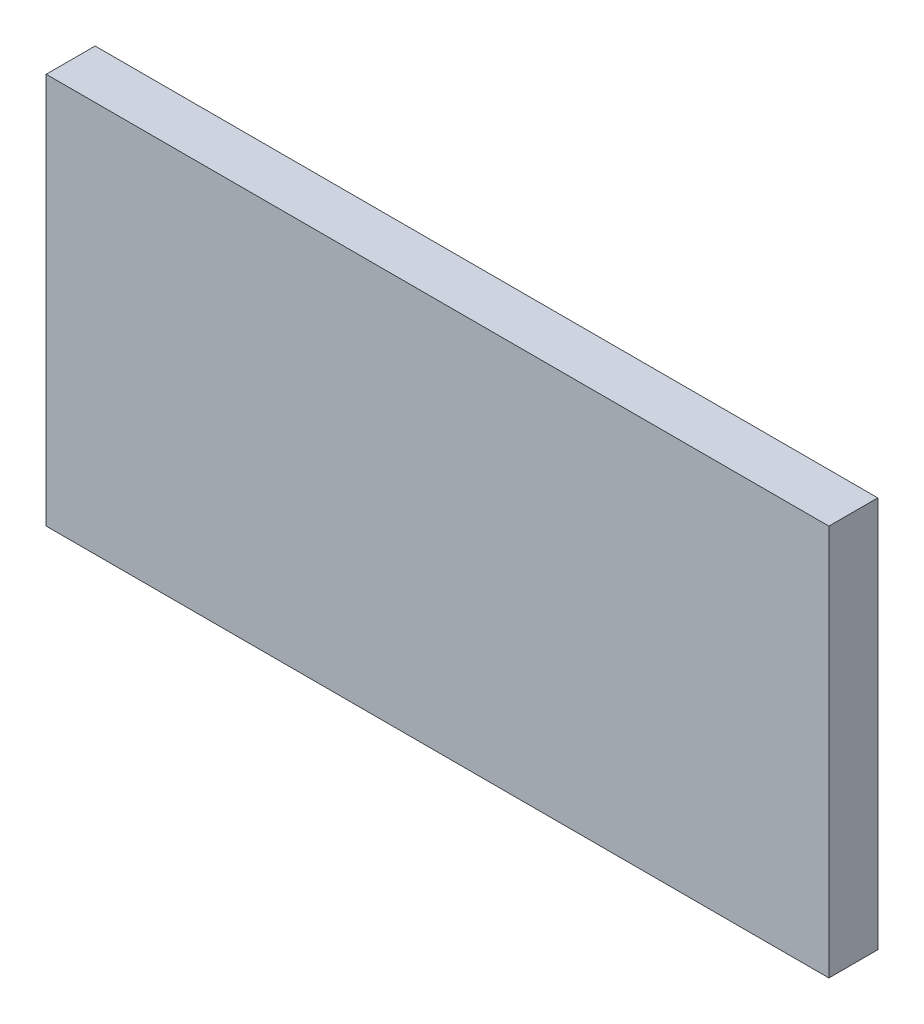
ISO-10303-21;
HEADER;
FILE_DESCRIPTION(('STEP AP214'),'2;1');
FILE_NAME('part.step','',(''),(''),'','','');
FILE_SCHEMA(('AUTOMOTIVE_DESIGN { 1 0 10303 214 1 1 1 1 }'));
ENDSEC;
DATA;
#1=APPLICATION_CONTEXT('core data for automotive mechanical design processes');
#2=APPLICATION_PROTOCOL_DEFINITION('international standard','automotive_design',2000,#1);
#3=PRODUCT_CONTEXT('',#1,'mechanical');
#4=PRODUCT('Part','Part','',(#3));
#5=PRODUCT_RELATED_PRODUCT_CATEGORY('part','',(#4));
#6=PRODUCT_DEFINITION_FORMATION('','',#4);
#7=PRODUCT_DEFINITION_CONTEXT('part definition',#1,'design');
#8=PRODUCT_DEFINITION('design','',#6,#7);
#9=PRODUCT_DEFINITION_SHAPE('','',#8);
#10=(LENGTH_UNIT() NAMED_UNIT(*) SI_UNIT(.MILLI.,.METRE.));
#11=(NAMED_UNIT(*) PLANE_ANGLE_UNIT() SI_UNIT($,.RADIAN.));
#12=(NAMED_UNIT(*) SI_UNIT($,.STERADIAN.) SOLID_ANGLE_UNIT());
#13=UNCERTAINTY_MEASURE_WITH_UNIT(LENGTH_MEASURE(1.E-05),#10,'distance_accuracy_value','');
#14=(GEOMETRIC_REPRESENTATION_CONTEXT(3) GLOBAL_UNCERTAINTY_ASSIGNED_CONTEXT((#13)) GLOBAL_UNIT_ASSIGNED_CONTEXT((#10,
#11,#12)) REPRESENTATION_CONTEXT('',''));
#15=CARTESIAN_POINT('',(0.,0.,0.));
#16=DIRECTION('',(0.,0.,1.));
#17=DIRECTION('',(1.,0.,0.));
#18=AXIS2_PLACEMENT_3D('',#15,#16,#17);
#19=CARTESIAN_POINT('',(12.7,87.15,1.5875));
#20=DIRECTION('',(-1.,0.,0.));
#21=DIRECTION('',(0.,0.,1.));
#22=AXIS2_PLACEMENT_3D('',#19,#20,#21);
#23=PLANE('',#22);
#24=DIRECTION('',(0.,1.,0.));
#25=VECTOR('',#24,1.);
#26=CARTESIAN_POINT('',(12.7,87.15,0.));
#27=LINE('',#26,#25);
#28=CARTESIAN_POINT('',(12.7,87.15,0.));
#29=VERTEX_POINT('',#28);
#30=CARTESIAN_POINT('',(12.7,99.85,0.));
#31=VERTEX_POINT('',#30);
#32=EDGE_CURVE('E102',#29,#31,#27,.T.);
#33=ORIENTED_EDGE('',*,*,#32,.T.);
#34=DIRECTION('',(0.,0.,-1.));
#35=VECTOR('',#34,1.);
#36=CARTESIAN_POINT('',(12.7,99.85,1.5875));
#37=LINE('',#36,#35);
#38=CARTESIAN_POINT('',(12.7,99.85,1.5875));
#39=VERTEX_POINT('',#38);
#40=EDGE_CURVE('E11',#39,#31,#37,.T.);
#41=ORIENTED_EDGE('',*,*,#40,.F.);
#42=DIRECTION('',(0.,1.,0.));
#43=VECTOR('',#42,1.);
#44=CARTESIAN_POINT('',(12.7,87.15,1.5875));
#45=LINE('',#44,#43);
#46=CARTESIAN_POINT('',(12.7,87.15,1.5875));
#47=VERTEX_POINT('',#46);
#48=EDGE_CURVE('E90',#47,#39,#45,.T.);
#49=ORIENTED_EDGE('',*,*,#48,.F.);
#50=DIRECTION('',(0.,0.,-1.));
#51=VECTOR('',#50,1.);
#52=CARTESIAN_POINT('',(12.7,87.15,1.5875));
#53=LINE('',#52,#51);
#54=EDGE_CURVE('E98',#47,#29,#53,.T.);
#55=ORIENTED_EDGE('',*,*,#54,.T.);
#56=EDGE_LOOP('',(#33,#41,#49,#55));
#57=FACE_BOUND('',#56,.T.);
#58=ADVANCED_FACE('F39',(#57),#23,.F.);
#59=CARTESIAN_POINT('',(-12.7,99.85,1.5875));
#60=DIRECTION('',(0.,-1.,0.));
#61=DIRECTION('',(0.,0.,-1.));
#62=AXIS2_PLACEMENT_3D('',#59,#60,#61);
#63=PLANE('',#62);
#64=DIRECTION('',(-1.,0.,0.));
#65=VECTOR('',#64,1.);
#66=CARTESIAN_POINT('',(-12.7,99.85,0.));
#67=LINE('',#66,#65);
#68=CARTESIAN_POINT('',(-12.7,99.85,0.));
#69=VERTEX_POINT('',#68);
#70=EDGE_CURVE('E94',#31,#69,#67,.T.);
#71=ORIENTED_EDGE('',*,*,#70,.T.);
#72=DIRECTION('',(0.,0.,-1.));
#73=VECTOR('',#72,1.);
#74=CARTESIAN_POINT('',(-12.7,99.85,1.5875));
#75=LINE('',#74,#73);
#76=CARTESIAN_POINT('',(-12.7,99.85,1.5875));
#77=VERTEX_POINT('',#76);
#78=EDGE_CURVE('E47',#77,#69,#75,.T.);
#79=ORIENTED_EDGE('',*,*,#78,.F.);
#80=DIRECTION('',(-1.,0.,0.));
#81=VECTOR('',#80,1.);
#82=CARTESIAN_POINT('',(-12.7,99.85,1.5875));
#83=LINE('',#82,#81);
#84=EDGE_CURVE('E85',#39,#77,#83,.T.);
#85=ORIENTED_EDGE('',*,*,#84,.F.);
#86=ORIENTED_EDGE('',*,*,#40,.T.);
#87=EDGE_LOOP('',(#71,#79,#85,#86));
#88=FACE_BOUND('',#87,.T.);
#89=ADVANCED_FACE('F93',(#88),#63,.F.);
#90=CARTESIAN_POINT('',(-12.7,87.15,1.5875));
#91=DIRECTION('',(1.,0.,0.));
#92=DIRECTION('',(0.,0.,-1.));
#93=AXIS2_PLACEMENT_3D('',#90,#91,#92);
#94=PLANE('',#93);
#95=DIRECTION('',(0.,-1.,0.));
#96=VECTOR('',#95,1.);
#97=CARTESIAN_POINT('',(-12.7,87.15,0.));
#98=LINE('',#97,#96);
#99=CARTESIAN_POINT('',(-12.7,87.15,0.));
#100=VERTEX_POINT('',#99);
#101=EDGE_CURVE('E72',#69,#100,#98,.T.);
#102=ORIENTED_EDGE('',*,*,#101,.T.);
#103=DIRECTION('',(0.,0.,-1.));
#104=VECTOR('',#103,1.);
#105=CARTESIAN_POINT('',(-12.7,87.15,1.5875));
#106=LINE('',#105,#104);
#107=CARTESIAN_POINT('',(-12.7,87.15,1.5875));
#108=VERTEX_POINT('',#107);
#109=EDGE_CURVE('E95',#108,#100,#106,.T.);
#110=ORIENTED_EDGE('',*,*,#109,.F.);
#111=DIRECTION('',(0.,-1.,0.));
#112=VECTOR('',#111,1.);
#113=CARTESIAN_POINT('',(-12.7,87.15,1.5875));
#114=LINE('',#113,#112);
#115=EDGE_CURVE('E88',#77,#108,#114,.T.);
#116=ORIENTED_EDGE('',*,*,#115,.F.);
#117=ORIENTED_EDGE('',*,*,#78,.T.);
#118=EDGE_LOOP('',(#102,#110,#116,#117));
#119=FACE_BOUND('',#118,.T.);
#120=ADVANCED_FACE('F96',(#119),#94,.F.);
#121=CARTESIAN_POINT('',(-12.7,87.15,1.5875));
#122=DIRECTION('',(0.,1.,0.));
#123=DIRECTION('',(0.,0.,1.));
#124=AXIS2_PLACEMENT_3D('',#121,#122,#123);
#125=PLANE('',#124);
#126=DIRECTION('',(1.,0.,0.));
#127=VECTOR('',#126,1.);
#128=CARTESIAN_POINT('',(-12.7,87.15,0.));
#129=LINE('',#128,#127);
#130=EDGE_CURVE('E78',#100,#29,#129,.T.);
#131=ORIENTED_EDGE('',*,*,#130,.T.);
#132=ORIENTED_EDGE('',*,*,#54,.F.);
#133=DIRECTION('',(1.,0.,0.));
#134=VECTOR('',#133,1.);
#135=CARTESIAN_POINT('',(-12.7,87.15,1.5875));
#136=LINE('',#135,#134);
#137=EDGE_CURVE('E55',#108,#47,#136,.T.);
#138=ORIENTED_EDGE('',*,*,#137,.F.);
#139=ORIENTED_EDGE('',*,*,#109,.T.);
#140=EDGE_LOOP('',(#131,#132,#138,#139));
#141=FACE_BOUND('',#140,.T.);
#142=ADVANCED_FACE('F109',(#141),#125,.F.);
#143=CARTESIAN_POINT('',(0.,0.,1.5875));
#144=DIRECTION('',(0.,0.,-1.));
#145=DIRECTION('',(-1.,0.,0.));
#146=AXIS2_PLACEMENT_3D('',#143,#144,#145);
#147=PLANE('',#146);
#148=ORIENTED_EDGE('',*,*,#48,.T.);
#149=ORIENTED_EDGE('',*,*,#84,.T.);
#150=ORIENTED_EDGE('',*,*,#115,.T.);
#151=ORIENTED_EDGE('',*,*,#137,.T.);
#152=EDGE_LOOP('',(#148,#149,#150,#151));
#153=FACE_BOUND('',#152,.T.);
#154=ADVANCED_FACE('F86',(#153),#147,.F.);
#155=CARTESIAN_POINT('',(0.,0.,0.));
#156=DIRECTION('',(0.,0.,-1.));
#157=DIRECTION('',(-1.,0.,0.));
#158=AXIS2_PLACEMENT_3D('',#155,#156,#157);
#159=PLANE('',#158);
#160=ORIENTED_EDGE('',*,*,#32,.F.);
#161=ORIENTED_EDGE('',*,*,#130,.F.);
#162=ORIENTED_EDGE('',*,*,#101,.F.);
#163=ORIENTED_EDGE('',*,*,#70,.F.);
#164=EDGE_LOOP('',(#160,#161,#162,#163));
#165=FACE_BOUND('',#164,.T.);
#166=ADVANCED_FACE('F112',(#165),#159,.T.);
#167=CLOSED_SHELL('',(#58,#89,#120,#142,#154,#166));
#168=MANIFOLD_SOLID_BREP('B2',#167);
#169=ADVANCED_BREP_SHAPE_REPRESENTATION('',(#18,#168),#14);
#170=SHAPE_DEFINITION_REPRESENTATION(#9,#169);
ENDSEC;
END-ISO-10303-21;
